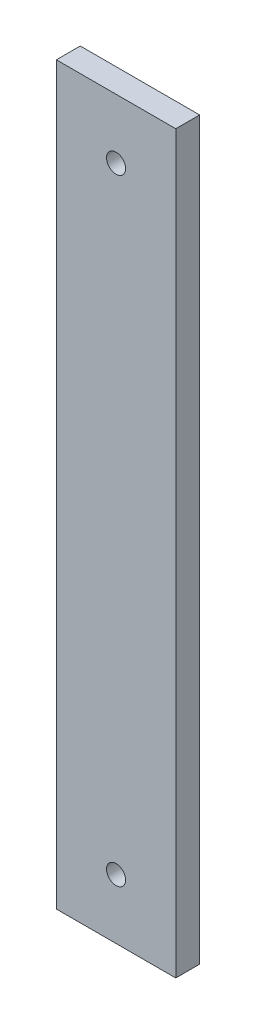
ISO-10303-21;
HEADER;
FILE_DESCRIPTION(('STEP AP214'),'2;1');
FILE_NAME('part.step','',(''),(''),'','','');
FILE_SCHEMA(('AUTOMOTIVE_DESIGN { 1 0 10303 214 1 1 1 1 }'));
ENDSEC;
DATA;
#1=APPLICATION_CONTEXT('core data for automotive mechanical design processes');
#2=APPLICATION_PROTOCOL_DEFINITION('international standard','automotive_design',2000,#1);
#3=PRODUCT_CONTEXT('',#1,'mechanical');
#4=PRODUCT('Part','Part','',(#3));
#5=PRODUCT_RELATED_PRODUCT_CATEGORY('part','',(#4));
#6=PRODUCT_DEFINITION_FORMATION('','',#4);
#7=PRODUCT_DEFINITION_CONTEXT('part definition',#1,'design');
#8=PRODUCT_DEFINITION('design','',#6,#7);
#9=PRODUCT_DEFINITION_SHAPE('','',#8);
#10=(LENGTH_UNIT() NAMED_UNIT(*) SI_UNIT(.MILLI.,.METRE.));
#11=(NAMED_UNIT(*) PLANE_ANGLE_UNIT() SI_UNIT($,.RADIAN.));
#12=(NAMED_UNIT(*) SI_UNIT($,.STERADIAN.) SOLID_ANGLE_UNIT());
#13=UNCERTAINTY_MEASURE_WITH_UNIT(LENGTH_MEASURE(1.E-05),#10,'distance_accuracy_value','');
#14=(GEOMETRIC_REPRESENTATION_CONTEXT(3) GLOBAL_UNCERTAINTY_ASSIGNED_CONTEXT((#13)) GLOBAL_UNIT_ASSIGNED_CONTEXT((#10,
#11,#12)) REPRESENTATION_CONTEXT('',''));
#15=CARTESIAN_POINT('',(0.,0.,0.));
#16=DIRECTION('',(0.,0.,1.));
#17=DIRECTION('',(1.,0.,0.));
#18=AXIS2_PLACEMENT_3D('',#15,#16,#17);
#19=CARTESIAN_POINT('',(25.,154.,5.));
#20=DIRECTION('',(-1.,0.,0.));
#21=DIRECTION('',(0.,0.,1.));
#22=AXIS2_PLACEMENT_3D('',#19,#20,#21);
#23=PLANE('',#22);
#24=DIRECTION('',(0.,0.,-1.));
#25=VECTOR('',#24,1.);
#26=CARTESIAN_POINT('',(25.,-154.,5.));
#27=LINE('',#26,#25);
#28=CARTESIAN_POINT('',(25.,-154.,5.));
#29=VERTEX_POINT('',#28);
#30=CARTESIAN_POINT('',(25.,-154.,-5.));
#31=VERTEX_POINT('',#30);
#32=EDGE_CURVE('E96',#29,#31,#27,.T.);
#33=ORIENTED_EDGE('',*,*,#32,.T.);
#34=DIRECTION('',(0.,-1.,0.));
#35=VECTOR('',#34,1.);
#36=CARTESIAN_POINT('',(25.,154.,-5.));
#37=LINE('',#36,#35);
#38=CARTESIAN_POINT('',(25.,154.,-5.));
#39=VERTEX_POINT('',#38);
#40=EDGE_CURVE('E11',#39,#31,#37,.T.);
#41=ORIENTED_EDGE('',*,*,#40,.F.);
#42=DIRECTION('',(0.,0.,-1.));
#43=VECTOR('',#42,1.);
#44=CARTESIAN_POINT('',(25.,154.,5.));
#45=LINE('',#44,#43);
#46=CARTESIAN_POINT('',(25.,154.,5.));
#47=VERTEX_POINT('',#46);
#48=EDGE_CURVE('E84',#47,#39,#45,.T.);
#49=ORIENTED_EDGE('',*,*,#48,.F.);
#50=DIRECTION('',(0.,-1.,0.));
#51=VECTOR('',#50,1.);
#52=CARTESIAN_POINT('',(25.,154.,5.));
#53=LINE('',#52,#51);
#54=EDGE_CURVE('E92',#47,#29,#53,.T.);
#55=ORIENTED_EDGE('',*,*,#54,.T.);
#56=EDGE_LOOP('',(#33,#41,#49,#55));
#57=FACE_BOUND('',#56,.T.);
#58=ADVANCED_FACE('F33',(#57),#23,.F.);
#59=CARTESIAN_POINT('',(-25.,154.,-5.));
#60=DIRECTION('',(0.,0.,1.));
#61=DIRECTION('',(1.,0.,0.));
#62=AXIS2_PLACEMENT_3D('',#59,#60,#61);
#63=PLANE('',#62);
#64=CARTESIAN_POINT('',(0.,-129.,-5.));
#65=DIRECTION('',(0.,0.,-1.));
#66=DIRECTION('',(-1.,0.,0.));
#67=AXIS2_PLACEMENT_3D('',#64,#65,#66);
#68=CIRCLE('',#67,4.);
#69=CARTESIAN_POINT('',(-4.,-129.,-5.));
#70=VERTEX_POINT('',#69);
#71=EDGE_CURVE('E116',#70,#70,#68,.T.);
#72=ORIENTED_EDGE('',*,*,#71,.F.);
#73=EDGE_LOOP('',(#72));
#74=FACE_BOUND('',#73,.T.);
#75=CARTESIAN_POINT('',(0.,129.,-5.));
#76=DIRECTION('',(0.,0.,-1.));
#77=DIRECTION('',(1.,0.,0.));
#78=AXIS2_PLACEMENT_3D('',#75,#76,#77);
#79=CIRCLE('',#78,4.);
#80=CARTESIAN_POINT('',(4.,129.,-5.));
#81=VERTEX_POINT('',#80);
#82=EDGE_CURVE('E110',#81,#81,#79,.T.);
#83=ORIENTED_EDGE('',*,*,#82,.F.);
#84=EDGE_LOOP('',(#83));
#85=FACE_BOUND('',#84,.T.);
#86=DIRECTION('',(-1.,0.,0.));
#87=VECTOR('',#86,1.);
#88=CARTESIAN_POINT('',(-25.,-154.,-5.));
#89=LINE('',#88,#87);
#90=CARTESIAN_POINT('',(-25.,-154.,-5.));
#91=VERTEX_POINT('',#90);
#92=EDGE_CURVE('E88',#31,#91,#89,.T.);
#93=ORIENTED_EDGE('',*,*,#92,.T.);
#94=DIRECTION('',(0.,-1.,0.));
#95=VECTOR('',#94,1.);
#96=CARTESIAN_POINT('',(-25.,154.,-5.));
#97=LINE('',#96,#95);
#98=CARTESIAN_POINT('',(-25.,154.,-5.));
#99=VERTEX_POINT('',#98);
#100=EDGE_CURVE('E41',#99,#91,#97,.T.);
#101=ORIENTED_EDGE('',*,*,#100,.F.);
#102=DIRECTION('',(-1.,0.,0.));
#103=VECTOR('',#102,1.);
#104=CARTESIAN_POINT('',(-25.,154.,-5.));
#105=LINE('',#104,#103);
#106=EDGE_CURVE('E79',#39,#99,#105,.T.);
#107=ORIENTED_EDGE('',*,*,#106,.F.);
#108=ORIENTED_EDGE('',*,*,#40,.T.);
#109=EDGE_LOOP('',(#93,#101,#107,#108));
#110=FACE_BOUND('',#109,.T.);
#111=ADVANCED_FACE('F87',(#74,#85,#110),#63,.F.);
#112=CARTESIAN_POINT('',(-25.,154.,5.));
#113=DIRECTION('',(1.,0.,0.));
#114=DIRECTION('',(0.,0.,-1.));
#115=AXIS2_PLACEMENT_3D('',#112,#113,#114);
#116=PLANE('',#115);
#117=DIRECTION('',(0.,0.,1.));
#118=VECTOR('',#117,1.);
#119=CARTESIAN_POINT('',(-25.,-154.,5.));
#120=LINE('',#119,#118);
#121=CARTESIAN_POINT('',(-25.,-154.,5.));
#122=VERTEX_POINT('',#121);
#123=EDGE_CURVE('E66',#91,#122,#120,.T.);
#124=ORIENTED_EDGE('',*,*,#123,.T.);
#125=DIRECTION('',(0.,-1.,0.));
#126=VECTOR('',#125,1.);
#127=CARTESIAN_POINT('',(-25.,154.,5.));
#128=LINE('',#127,#126);
#129=CARTESIAN_POINT('',(-25.,154.,5.));
#130=VERTEX_POINT('',#129);
#131=EDGE_CURVE('E89',#130,#122,#128,.T.);
#132=ORIENTED_EDGE('',*,*,#131,.F.);
#133=DIRECTION('',(0.,0.,1.));
#134=VECTOR('',#133,1.);
#135=CARTESIAN_POINT('',(-25.,154.,5.));
#136=LINE('',#135,#134);
#137=EDGE_CURVE('E82',#99,#130,#136,.T.);
#138=ORIENTED_EDGE('',*,*,#137,.F.);
#139=ORIENTED_EDGE('',*,*,#100,.T.);
#140=EDGE_LOOP('',(#124,#132,#138,#139));
#141=FACE_BOUND('',#140,.T.);
#142=ADVANCED_FACE('F90',(#141),#116,.F.);
#143=CARTESIAN_POINT('',(-25.,154.,5.));
#144=DIRECTION('',(0.,0.,-1.));
#145=DIRECTION('',(-1.,0.,0.));
#146=AXIS2_PLACEMENT_3D('',#143,#144,#145);
#147=PLANE('',#146);
#148=CARTESIAN_POINT('',(0.,-129.,5.));
#149=DIRECTION('',(0.,0.,-1.));
#150=DIRECTION('',(-1.,0.,0.));
#151=AXIS2_PLACEMENT_3D('',#148,#149,#150);
#152=CIRCLE('',#151,4.);
#153=CARTESIAN_POINT('',(-4.,-129.,5.));
#154=VERTEX_POINT('',#153);
#155=EDGE_CURVE('E99',#154,#154,#152,.T.);
#156=ORIENTED_EDGE('',*,*,#155,.T.);
#157=EDGE_LOOP('',(#156));
#158=FACE_BOUND('',#157,.T.);
#159=CARTESIAN_POINT('',(0.,129.,5.));
#160=DIRECTION('',(0.,0.,-1.));
#161=DIRECTION('',(1.,0.,0.));
#162=AXIS2_PLACEMENT_3D('',#159,#160,#161);
#163=CIRCLE('',#162,4.);
#164=CARTESIAN_POINT('',(4.,129.,5.));
#165=VERTEX_POINT('',#164);
#166=EDGE_CURVE('E113',#165,#165,#163,.T.);
#167=ORIENTED_EDGE('',*,*,#166,.T.);
#168=EDGE_LOOP('',(#167));
#169=FACE_BOUND('',#168,.T.);
#170=DIRECTION('',(1.,0.,0.));
#171=VECTOR('',#170,1.);
#172=CARTESIAN_POINT('',(-25.,-154.,5.));
#173=LINE('',#172,#171);
#174=EDGE_CURVE('E72',#122,#29,#173,.T.);
#175=ORIENTED_EDGE('',*,*,#174,.T.);
#176=ORIENTED_EDGE('',*,*,#54,.F.);
#177=DIRECTION('',(1.,0.,0.));
#178=VECTOR('',#177,1.);
#179=CARTESIAN_POINT('',(-25.,154.,5.));
#180=LINE('',#179,#178);
#181=EDGE_CURVE('E49',#130,#47,#180,.T.);
#182=ORIENTED_EDGE('',*,*,#181,.F.);
#183=ORIENTED_EDGE('',*,*,#131,.T.);
#184=EDGE_LOOP('',(#175,#176,#182,#183));
#185=FACE_BOUND('',#184,.T.);
#186=ADVANCED_FACE('F104',(#158,#169,#185),#147,.F.);
#187=CARTESIAN_POINT('',(0.,154.,0.));
#188=DIRECTION('',(0.,-1.,0.));
#189=DIRECTION('',(0.,0.,-1.));
#190=AXIS2_PLACEMENT_3D('',#187,#188,#189);
#191=PLANE('',#190);
#192=ORIENTED_EDGE('',*,*,#48,.T.);
#193=ORIENTED_EDGE('',*,*,#106,.T.);
#194=ORIENTED_EDGE('',*,*,#137,.T.);
#195=ORIENTED_EDGE('',*,*,#181,.T.);
#196=EDGE_LOOP('',(#192,#193,#194,#195));
#197=FACE_BOUND('',#196,.T.);
#198=ADVANCED_FACE('F80',(#197),#191,.F.);
#199=CARTESIAN_POINT('',(0.,-154.,0.));
#200=DIRECTION('',(0.,-1.,0.));
#201=DIRECTION('',(0.,0.,-1.));
#202=AXIS2_PLACEMENT_3D('',#199,#200,#201);
#203=PLANE('',#202);
#204=ORIENTED_EDGE('',*,*,#32,.F.);
#205=ORIENTED_EDGE('',*,*,#174,.F.);
#206=ORIENTED_EDGE('',*,*,#123,.F.);
#207=ORIENTED_EDGE('',*,*,#92,.F.);
#208=EDGE_LOOP('',(#204,#205,#206,#207));
#209=FACE_BOUND('',#208,.T.);
#210=ADVANCED_FACE('F107',(#209),#203,.T.);
#211=CARTESIAN_POINT('',(0.,129.,5.));
#212=DIRECTION('',(0.,0.,-1.));
#213=DIRECTION('',(-1.,0.,0.));
#214=AXIS2_PLACEMENT_3D('',#211,#212,#213);
#215=CYLINDRICAL_SURFACE('',#214,4.);
#216=ORIENTED_EDGE('',*,*,#166,.F.);
#217=EDGE_LOOP('',(#216));
#218=FACE_BOUND('',#217,.T.);
#219=ORIENTED_EDGE('',*,*,#82,.T.);
#220=EDGE_LOOP('',(#219));
#221=FACE_BOUND('',#220,.T.);
#222=ADVANCED_FACE('F127',(#218,#221),#215,.F.);
#223=CARTESIAN_POINT('',(0.,-129.,5.));
#224=DIRECTION('',(0.,0.,-1.));
#225=DIRECTION('',(-1.,0.,0.));
#226=AXIS2_PLACEMENT_3D('',#223,#224,#225);
#227=CYLINDRICAL_SURFACE('',#226,4.);
#228=ORIENTED_EDGE('',*,*,#155,.F.);
#229=EDGE_LOOP('',(#228));
#230=FACE_BOUND('',#229,.T.);
#231=ORIENTED_EDGE('',*,*,#71,.T.);
#232=EDGE_LOOP('',(#231));
#233=FACE_BOUND('',#232,.T.);
#234=ADVANCED_FACE('F124',(#230,#233),#227,.F.);
#235=CLOSED_SHELL('',(#58,#111,#142,#186,#198,#210,#222,#234));
#236=MANIFOLD_SOLID_BREP('B2',#235);
#237=ADVANCED_BREP_SHAPE_REPRESENTATION('',(#18,#236),#14);
#238=SHAPE_DEFINITION_REPRESENTATION(#9,#237);
ENDSEC;
END-ISO-10303-21;
